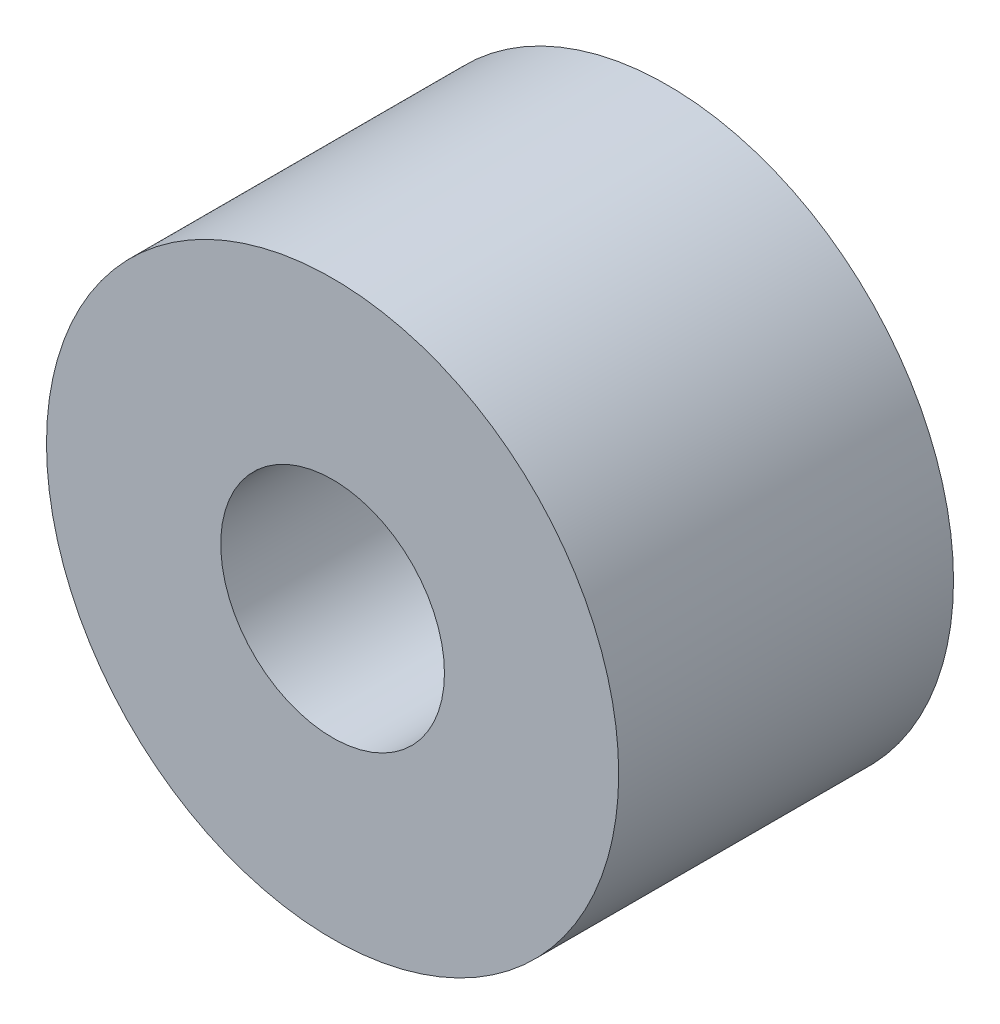
ISO-10303-21;
HEADER;
FILE_DESCRIPTION(('STEP AP214'),'2;1');
FILE_NAME('part.step','',(''),(''),'','','');
FILE_SCHEMA(('AUTOMOTIVE_DESIGN { 1 0 10303 214 1 1 1 1 }'));
ENDSEC;
DATA;
#1=APPLICATION_CONTEXT('core data for automotive mechanical design processes');
#2=APPLICATION_PROTOCOL_DEFINITION('international standard','automotive_design',2000,#1);
#3=PRODUCT_CONTEXT('',#1,'mechanical');
#4=PRODUCT('Part','Part','',(#3));
#5=PRODUCT_RELATED_PRODUCT_CATEGORY('part','',(#4));
#6=PRODUCT_DEFINITION_FORMATION('','',#4);
#7=PRODUCT_DEFINITION_CONTEXT('part definition',#1,'design');
#8=PRODUCT_DEFINITION('design','',#6,#7);
#9=PRODUCT_DEFINITION_SHAPE('','',#8);
#10=(LENGTH_UNIT() NAMED_UNIT(*) SI_UNIT(.MILLI.,.METRE.));
#11=(NAMED_UNIT(*) PLANE_ANGLE_UNIT() SI_UNIT($,.RADIAN.));
#12=(NAMED_UNIT(*) SI_UNIT($,.STERADIAN.) SOLID_ANGLE_UNIT());
#13=UNCERTAINTY_MEASURE_WITH_UNIT(LENGTH_MEASURE(1.E-05),#10,'distance_accuracy_value','');
#14=(GEOMETRIC_REPRESENTATION_CONTEXT(3) GLOBAL_UNCERTAINTY_ASSIGNED_CONTEXT((#13)) GLOBAL_UNIT_ASSIGNED_CONTEXT((#10,
#11,#12)) REPRESENTATION_CONTEXT('',''));
#15=CARTESIAN_POINT('',(0.,0.,0.));
#16=DIRECTION('',(0.,0.,1.));
#17=DIRECTION('',(1.,0.,0.));
#18=AXIS2_PLACEMENT_3D('',#15,#16,#17);
#19=CARTESIAN_POINT('',(0.,0.,5.588));
#20=DIRECTION('',(0.,0.,1.));
#21=DIRECTION('',(1.,0.,0.));
#22=AXIS2_PLACEMENT_3D('',#19,#20,#21);
#23=PLANE('',#22);
#24=CARTESIAN_POINT('',(0.,0.,5.588));
#25=DIRECTION('',(0.,0.,1.));
#26=DIRECTION('',(1.,0.,0.));
#27=AXIS2_PLACEMENT_3D('',#24,#25,#26);
#28=CIRCLE('',#27,4.775);
#29=CARTESIAN_POINT('',(4.775,0.,5.588));
#30=VERTEX_POINT('',#29);
#31=EDGE_CURVE('E10',#30,#30,#28,.T.);
#32=ORIENTED_EDGE('',*,*,#31,.T.);
#33=EDGE_LOOP('',(#32));
#34=FACE_BOUND('',#33,.T.);
#35=CARTESIAN_POINT('',(0.,0.,5.588));
#36=DIRECTION('',(0.,0.,1.));
#37=DIRECTION('',(1.,0.,0.));
#38=AXIS2_PLACEMENT_3D('',#35,#36,#37);
#39=CIRCLE('',#38,1.8669);
#40=CARTESIAN_POINT('',(1.8669,0.,5.588));
#41=VERTEX_POINT('',#40);
#42=EDGE_CURVE('E46',#41,#41,#39,.T.);
#43=ORIENTED_EDGE('',*,*,#42,.F.);
#44=EDGE_LOOP('',(#43));
#45=FACE_BOUND('',#44,.T.);
#46=ADVANCED_FACE('F35',(#34,#45),#23,.T.);
#47=CARTESIAN_POINT('',(0.,0.,0.));
#48=DIRECTION('',(0.,0.,1.));
#49=DIRECTION('',(1.,0.,0.));
#50=AXIS2_PLACEMENT_3D('',#47,#48,#49);
#51=PLANE('',#50);
#52=CARTESIAN_POINT('',(0.,0.,0.));
#53=DIRECTION('',(0.,0.,1.));
#54=DIRECTION('',(1.,0.,0.));
#55=AXIS2_PLACEMENT_3D('',#52,#53,#54);
#56=CIRCLE('',#55,4.775);
#57=CARTESIAN_POINT('',(4.775,0.,0.));
#58=VERTEX_POINT('',#57);
#59=EDGE_CURVE('E39',#58,#58,#56,.T.);
#60=ORIENTED_EDGE('',*,*,#59,.F.);
#61=EDGE_LOOP('',(#60));
#62=FACE_BOUND('',#61,.T.);
#63=CARTESIAN_POINT('',(0.,0.,0.));
#64=DIRECTION('',(0.,0.,1.));
#65=DIRECTION('',(1.,0.,0.));
#66=AXIS2_PLACEMENT_3D('',#63,#64,#65);
#67=CIRCLE('',#66,1.8669);
#68=CARTESIAN_POINT('',(1.8669,0.,0.));
#69=VERTEX_POINT('',#68);
#70=EDGE_CURVE('E48',#69,#69,#67,.T.);
#71=ORIENTED_EDGE('',*,*,#70,.T.);
#72=EDGE_LOOP('',(#71));
#73=FACE_BOUND('',#72,.T.);
#74=ADVANCED_FACE('F58',(#62,#73),#51,.F.);
#75=CARTESIAN_POINT('',(0.,0.,5.588));
#76=DIRECTION('',(0.,0.,-1.));
#77=DIRECTION('',(-1.,0.,0.));
#78=AXIS2_PLACEMENT_3D('',#75,#76,#77);
#79=CYLINDRICAL_SURFACE('',#78,4.775);
#80=ORIENTED_EDGE('',*,*,#31,.F.);
#81=EDGE_LOOP('',(#80));
#82=FACE_BOUND('',#81,.T.);
#83=ORIENTED_EDGE('',*,*,#59,.T.);
#84=EDGE_LOOP('',(#83));
#85=FACE_BOUND('',#84,.T.);
#86=ADVANCED_FACE('F37',(#82,#85),#79,.T.);
#87=CARTESIAN_POINT('',(0.,0.,5.588));
#88=DIRECTION('',(0.,0.,-1.));
#89=DIRECTION('',(-1.,0.,0.));
#90=AXIS2_PLACEMENT_3D('',#87,#88,#89);
#91=CYLINDRICAL_SURFACE('',#90,1.8669);
#92=ORIENTED_EDGE('',*,*,#42,.T.);
#93=EDGE_LOOP('',(#92));
#94=FACE_BOUND('',#93,.T.);
#95=ORIENTED_EDGE('',*,*,#70,.F.);
#96=EDGE_LOOP('',(#95));
#97=FACE_BOUND('',#96,.T.);
#98=ADVANCED_FACE('F54',(#94,#97),#91,.F.);
#99=CLOSED_SHELL('',(#46,#74,#86,#98));
#100=MANIFOLD_SOLID_BREP('B2',#99);
#101=ADVANCED_BREP_SHAPE_REPRESENTATION('',(#18,#100),#14);
#102=SHAPE_DEFINITION_REPRESENTATION(#9,#101);
ENDSEC;
END-ISO-10303-21;
